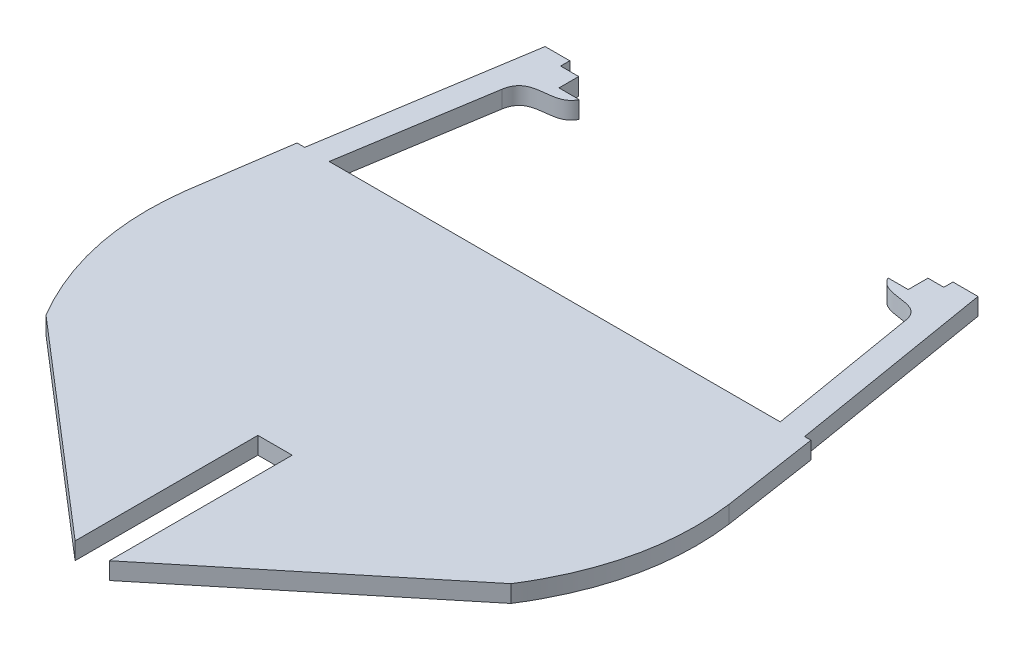
ISO-10303-21;
HEADER;
FILE_DESCRIPTION(('STEP AP214'),'2;1');
FILE_NAME('part.step','',(''),(''),'','','');
FILE_SCHEMA(('AUTOMOTIVE_DESIGN { 1 0 10303 214 1 1 1 1 }'));
ENDSEC;
DATA;
#1=APPLICATION_CONTEXT('core data for automotive mechanical design processes');
#2=APPLICATION_PROTOCOL_DEFINITION('international standard','automotive_design',2000,#1);
#3=PRODUCT_CONTEXT('',#1,'mechanical');
#4=PRODUCT('Part','Part','',(#3));
#5=PRODUCT_RELATED_PRODUCT_CATEGORY('part','',(#4));
#6=PRODUCT_DEFINITION_FORMATION('','',#4);
#7=PRODUCT_DEFINITION_CONTEXT('part definition',#1,'design');
#8=PRODUCT_DEFINITION('design','',#6,#7);
#9=PRODUCT_DEFINITION_SHAPE('','',#8);
#10=(LENGTH_UNIT() NAMED_UNIT(*) SI_UNIT(.MILLI.,.METRE.));
#11=(NAMED_UNIT(*) PLANE_ANGLE_UNIT() SI_UNIT($,.RADIAN.));
#12=(NAMED_UNIT(*) SI_UNIT($,.STERADIAN.) SOLID_ANGLE_UNIT());
#13=UNCERTAINTY_MEASURE_WITH_UNIT(LENGTH_MEASURE(1.E-05),#10,'distance_accuracy_value','');
#14=(GEOMETRIC_REPRESENTATION_CONTEXT(3) GLOBAL_UNCERTAINTY_ASSIGNED_CONTEXT((#13)) GLOBAL_UNIT_ASSIGNED_CONTEXT((#10,
#11,#12)) REPRESENTATION_CONTEXT('',''));
#15=CARTESIAN_POINT('',(0.,0.,0.));
#16=DIRECTION('',(0.,0.,1.));
#17=DIRECTION('',(1.,0.,0.));
#18=AXIS2_PLACEMENT_3D('',#15,#16,#17);
#19=CARTESIAN_POINT('',(-7.33547800549502,4.,-1.07714586189832));
#20=DIRECTION('',(0.989390194390958,0.,0.145282632282813));
#21=DIRECTION('',(0.145282632282813,0.,-0.989390194390958));
#22=AXIS2_PLACEMENT_3D('',#19,#20,#21);
#23=PLANE('',#22);
#24=DIRECTION('',(-0.145282632282813,0.,0.989390194390958));
#25=VECTOR('',#24,1.);
#26=CARTESIAN_POINT('',(-7.33547800549502,0.,-1.07714586189832));
#27=LINE('',#26,#25);
#28=CARTESIAN_POINT('',(-7.4936467310962,0.,0.));
#29=VERTEX_POINT('',#28);
#30=CARTESIAN_POINT('',(-10.8148658668984,0.,22.6178559319447));
#31=VERTEX_POINT('',#30);
#32=EDGE_CURVE('E258',#29,#31,#27,.T.);
#33=ORIENTED_EDGE('',*,*,#32,.T.);
#34=DIRECTION('',(0.,-1.,0.));
#35=VECTOR('',#34,1.);
#36=CARTESIAN_POINT('',(-10.8148658668984,4.,22.6178559319447));
#37=LINE('',#36,#35);
#38=CARTESIAN_POINT('',(-10.8148658668984,4.,22.6178559319447));
#39=VERTEX_POINT('',#38);
#40=EDGE_CURVE('E11',#39,#31,#37,.T.);
#41=ORIENTED_EDGE('',*,*,#40,.F.);
#42=DIRECTION('',(-0.145282632282813,0.,0.989390194390958));
#43=VECTOR('',#42,1.);
#44=CARTESIAN_POINT('',(-7.33547800549502,4.,-1.07714586189832));
#45=LINE('',#44,#43);
#46=CARTESIAN_POINT('',(-7.4936467310962,4.,0.));
#47=VERTEX_POINT('',#46);
#48=EDGE_CURVE('E348',#47,#39,#45,.T.);
#49=ORIENTED_EDGE('',*,*,#48,.F.);
#50=DIRECTION('',(0.,-1.,0.));
#51=VECTOR('',#50,1.);
#52=CARTESIAN_POINT('',(-7.4936467310962,4.,0.));
#53=LINE('',#52,#51);
#54=EDGE_CURVE('E254',#47,#29,#53,.T.);
#55=ORIENTED_EDGE('',*,*,#54,.T.);
#56=EDGE_LOOP('',(#33,#41,#49,#55));
#57=FACE_BOUND('',#56,.T.);
#58=ADVANCED_FACE('F43',(#57),#23,.F.);
#59=CARTESIAN_POINT('',(-10.8148658668984,4.,22.6178559319447));
#60=CARTESIAN_POINT('',(-13.5831427047699,4.,44.4263441016462));
#61=CARTESIAN_POINT('',(-1.98899974035488,4.,64.010756010048));
#62=B_SPLINE_CURVE_WITH_KNOTS('',2,(#59,#60,#61),.UNSPECIFIED.,.F.,.F.,(3,3),(0.,1.),.UNSPECIFIED.);
#63=DIRECTION('',(0.,-1.,0.));
#64=VECTOR('',#63,1.);
#65=SURFACE_OF_LINEAR_EXTRUSION('',#62,#64);
#66=CARTESIAN_POINT('',(-10.8148658668984,0.,22.6178559319447));
#67=CARTESIAN_POINT('',(-13.5831427047699,0.,44.4263441016462));
#68=CARTESIAN_POINT('',(-1.98899974035488,0.,64.010756010048));
#69=B_SPLINE_CURVE_WITH_KNOTS('',2,(#66,#67,#68),.UNSPECIFIED.,.F.,.F.,(3,3),(0.,1.),.UNSPECIFIED.);
#70=CARTESIAN_POINT('',(-1.98899974035488,0.,64.010756010048));
#71=VERTEX_POINT('',#70);
#72=EDGE_CURVE('E261',#31,#71,#69,.T.);
#73=ORIENTED_EDGE('',*,*,#72,.T.);
#74=DIRECTION('',(0.,-1.,0.));
#75=VECTOR('',#74,1.);
#76=CARTESIAN_POINT('',(-1.98899974035488,4.,64.010756010048));
#77=LINE('',#76,#75);
#78=CARTESIAN_POINT('',(-1.98899974035488,4.,64.010756010048));
#79=VERTEX_POINT('',#78);
#80=EDGE_CURVE('E51',#79,#71,#77,.T.);
#81=ORIENTED_EDGE('',*,*,#80,.F.);
#82=EDGE_CURVE('E158',#39,#79,#62,.T.);
#83=ORIENTED_EDGE('',*,*,#82,.F.);
#84=ORIENTED_EDGE('',*,*,#40,.T.);
#85=EDGE_LOOP('',(#73,#81,#83,#84));
#86=FACE_BOUND('',#85,.T.);
#87=ADVANCED_FACE('F410',(#86),#65,.F.);
#88=CARTESIAN_POINT('',(-32.5002188720918,4.,37.7257732194009));
#89=DIRECTION('',(-0.652686136054112,0.,0.757628410107985));
#90=DIRECTION('',(0.757628410107985,0.,0.652686136054112));
#91=AXIS2_PLACEMENT_3D('',#88,#89,#90);
#92=PLANE('',#91);
#93=DIRECTION('',(-0.757628410107985,0.,-0.652686136054112));
#94=VECTOR('',#93,1.);
#95=CARTESIAN_POINT('',(-32.5002188720918,0.,37.7257732194009));
#96=LINE('',#95,#94);
#97=CARTESIAN_POINT('',(46.9680835929784,0.,106.186589343381));
#98=VERTEX_POINT('',#97);
#99=EDGE_CURVE('E266',#98,#71,#96,.T.);
#100=ORIENTED_EDGE('',*,*,#99,.F.);
#101=DIRECTION('',(0.,-1.,0.));
#102=VECTOR('',#101,1.);
#103=CARTESIAN_POINT('',(46.9680835929784,4.,106.186589343381));
#104=LINE('',#103,#102);
#105=CARTESIAN_POINT('',(46.9680835929784,4.,106.186589343381));
#106=VERTEX_POINT('',#105);
#107=EDGE_CURVE('E403',#106,#98,#104,.T.);
#108=ORIENTED_EDGE('',*,*,#107,.F.);
#109=DIRECTION('',(-0.757628410107985,0.,-0.652686136054112));
#110=VECTOR('',#109,1.);
#111=CARTESIAN_POINT('',(-32.5002188720918,4.,37.7257732194009));
#112=LINE('',#111,#110);
#113=EDGE_CURVE('E409',#106,#79,#112,.T.);
#114=ORIENTED_EDGE('',*,*,#113,.T.);
#115=ORIENTED_EDGE('',*,*,#80,.T.);
#116=EDGE_LOOP('',(#100,#108,#114,#115));
#117=FACE_BOUND('',#116,.T.);
#118=ADVANCED_FACE('F407',(#117),#92,.T.);
#119=CARTESIAN_POINT('',(46.9680835929784,4.,0.));
#120=DIRECTION('',(1.,0.,0.));
#121=DIRECTION('',(0.,0.,-1.));
#122=AXIS2_PLACEMENT_3D('',#119,#120,#121);
#123=PLANE('',#122);
#124=DIRECTION('',(0.,0.,1.));
#125=VECTOR('',#124,1.);
#126=CARTESIAN_POINT('',(46.9680835929784,0.,0.));
#127=LINE('',#126,#125);
#128=CARTESIAN_POINT('',(46.9680835929784,0.,63.586589343381));
#129=VERTEX_POINT('',#128);
#130=EDGE_CURVE('E272',#129,#98,#127,.T.);
#131=ORIENTED_EDGE('',*,*,#130,.F.);
#132=DIRECTION('',(0.,-1.,0.));
#133=VECTOR('',#132,1.);
#134=CARTESIAN_POINT('',(46.9680835929784,4.,63.586589343381));
#135=LINE('',#134,#133);
#136=CARTESIAN_POINT('',(46.9680835929784,4.,63.586589343381));
#137=VERTEX_POINT('',#136);
#138=EDGE_CURVE('E401',#137,#129,#135,.T.);
#139=ORIENTED_EDGE('',*,*,#138,.F.);
#140=DIRECTION('',(0.,0.,1.));
#141=VECTOR('',#140,1.);
#142=CARTESIAN_POINT('',(46.9680835929784,4.,0.));
#143=LINE('',#142,#141);
#144=EDGE_CURVE('E421',#137,#106,#143,.T.);
#145=ORIENTED_EDGE('',*,*,#144,.T.);
#146=ORIENTED_EDGE('',*,*,#107,.T.);
#147=EDGE_LOOP('',(#131,#139,#145,#146));
#148=FACE_BOUND('',#147,.T.);
#149=ADVANCED_FACE('F418',(#148),#123,.T.);
#150=CARTESIAN_POINT('',(0.,4.,63.586589343381));
#151=DIRECTION('',(0.,0.,1.));
#152=DIRECTION('',(1.,0.,0.));
#153=AXIS2_PLACEMENT_3D('',#150,#151,#152);
#154=PLANE('',#153);
#155=DIRECTION('',(-1.,0.,0.));
#156=VECTOR('',#155,1.);
#157=CARTESIAN_POINT('',(0.,0.,63.586589343381));
#158=LINE('',#157,#156);
#159=CARTESIAN_POINT('',(54.9680835929783,0.,63.586589343381));
#160=VERTEX_POINT('',#159);
#161=EDGE_CURVE('E275',#160,#129,#158,.T.);
#162=ORIENTED_EDGE('',*,*,#161,.F.);
#163=DIRECTION('',(0.,-1.,0.));
#164=VECTOR('',#163,1.);
#165=CARTESIAN_POINT('',(54.9680835929783,4.,63.586589343381));
#166=LINE('',#165,#164);
#167=CARTESIAN_POINT('',(54.9680835929783,4.,63.586589343381));
#168=VERTEX_POINT('',#167);
#169=EDGE_CURVE('E399',#168,#160,#166,.T.);
#170=ORIENTED_EDGE('',*,*,#169,.F.);
#171=DIRECTION('',(-1.,0.,0.));
#172=VECTOR('',#171,1.);
#173=CARTESIAN_POINT('',(0.,4.,63.586589343381));
#174=LINE('',#173,#172);
#175=EDGE_CURVE('E425',#168,#137,#174,.T.);
#176=ORIENTED_EDGE('',*,*,#175,.T.);
#177=ORIENTED_EDGE('',*,*,#138,.T.);
#178=EDGE_LOOP('',(#162,#170,#176,#177));
#179=FACE_BOUND('',#178,.T.);
#180=ADVANCED_FACE('F466',(#179),#154,.T.);
#181=CARTESIAN_POINT('',(54.9680835929779,4.,-2.8651094847157E-13));
#182=DIRECTION('',(-1.,0.,0.));
#183=DIRECTION('',(0.,0.,1.));
#184=AXIS2_PLACEMENT_3D('',#181,#182,#183);
#185=PLANE('',#184);
#186=DIRECTION('',(0.,0.,-1.));
#187=VECTOR('',#186,1.);
#188=CARTESIAN_POINT('',(54.9680835929779,0.,-2.8651094847157E-13));
#189=LINE('',#188,#187);
#190=CARTESIAN_POINT('',(54.9680835929785,0.,106.186589343381));
#191=VERTEX_POINT('',#190);
#192=EDGE_CURVE('E278',#191,#160,#189,.T.);
#193=ORIENTED_EDGE('',*,*,#192,.F.);
#194=DIRECTION('',(0.,-1.,0.));
#195=VECTOR('',#194,1.);
#196=CARTESIAN_POINT('',(54.9680835929785,4.,106.186589343381));
#197=LINE('',#196,#195);
#198=CARTESIAN_POINT('',(54.9680835929785,4.,106.186589343381));
#199=VERTEX_POINT('',#198);
#200=EDGE_CURVE('E397',#199,#191,#197,.T.);
#201=ORIENTED_EDGE('',*,*,#200,.F.);
#202=DIRECTION('',(0.,0.,-1.));
#203=VECTOR('',#202,1.);
#204=CARTESIAN_POINT('',(54.9680835929779,4.,-2.8651094847157E-13));
#205=LINE('',#204,#203);
#206=EDGE_CURVE('E434',#199,#168,#205,.T.);
#207=ORIENTED_EDGE('',*,*,#206,.T.);
#208=ORIENTED_EDGE('',*,*,#169,.T.);
#209=EDGE_LOOP('',(#193,#201,#207,#208));
#210=FACE_BOUND('',#209,.T.);
#211=ADVANCED_FACE('F462',(#210),#185,.T.);
#212=CARTESIAN_POINT('',(74.1588937462754,4.,90.4527471306288));
#213=DIRECTION('',(0.63401640648034,0.,0.773319595195775));
#214=DIRECTION('',(0.773319595195775,0.,-0.63401640648034));
#215=AXIS2_PLACEMENT_3D('',#212,#213,#214);
#216=PLANE('',#215);
#217=DIRECTION('',(-0.773319595195775,0.,0.63401640648034));
#218=VECTOR('',#217,1.);
#219=CARTESIAN_POINT('',(74.1588937462754,0.,90.4527471306288));
#220=LINE('',#219,#218);
#221=CARTESIAN_POINT('',(106.410598371796,0.,64.010756010048));
#222=VERTEX_POINT('',#221);
#223=EDGE_CURVE('E281',#222,#191,#220,.T.);
#224=ORIENTED_EDGE('',*,*,#223,.F.);
#225=DIRECTION('',(0.,-1.,0.));
#226=VECTOR('',#225,1.);
#227=CARTESIAN_POINT('',(106.410598371796,4.,64.010756010048));
#228=LINE('',#227,#226);
#229=CARTESIAN_POINT('',(106.410598371796,4.,64.010756010048));
#230=VERTEX_POINT('',#229);
#231=EDGE_CURVE('E395',#230,#222,#228,.T.);
#232=ORIENTED_EDGE('',*,*,#231,.F.);
#233=DIRECTION('',(-0.773319595195775,0.,0.63401640648034));
#234=VECTOR('',#233,1.);
#235=CARTESIAN_POINT('',(74.1588937462754,4.,90.4527471306288));
#236=LINE('',#235,#234);
#237=EDGE_CURVE('E437',#230,#199,#236,.T.);
#238=ORIENTED_EDGE('',*,*,#237,.T.);
#239=ORIENTED_EDGE('',*,*,#200,.T.);
#240=EDGE_LOOP('',(#224,#232,#238,#239));
#241=FACE_BOUND('',#240,.T.);
#242=ADVANCED_FACE('F457',(#241),#216,.T.);
#243=CARTESIAN_POINT('',(115.792042318258,4.,22.6178559319438));
#244=CARTESIAN_POINT('',(118.672533555639,4.,44.533714829285));
#245=CARTESIAN_POINT('',(106.410598371796,4.,64.010756010048));
#246=B_SPLINE_CURVE_WITH_KNOTS('',2,(#243,#244,#245),.UNSPECIFIED.,.F.,.F.,(3,3),(0.,1.),.UNSPECIFIED.);
#247=DIRECTION('',(0.,-1.,0.));
#248=VECTOR('',#247,1.);
#249=SURFACE_OF_LINEAR_EXTRUSION('',#246,#248);
#250=CARTESIAN_POINT('',(115.792042318258,0.,22.6178559319438));
#251=CARTESIAN_POINT('',(118.672533555639,0.,44.533714829285));
#252=CARTESIAN_POINT('',(106.410598371796,0.,64.010756010048));
#253=B_SPLINE_CURVE_WITH_KNOTS('',2,(#250,#251,#252),.UNSPECIFIED.,.F.,.F.,(3,3),(0.,1.),.UNSPECIFIED.);
#254=CARTESIAN_POINT('',(115.792042318258,0.,22.6178559319438));
#255=VERTEX_POINT('',#254);
#256=EDGE_CURVE('E284',#255,#222,#253,.T.);
#257=ORIENTED_EDGE('',*,*,#256,.F.);
#258=DIRECTION('',(0.,-1.,0.));
#259=VECTOR('',#258,1.);
#260=CARTESIAN_POINT('',(115.792042318258,4.,22.6178559319438));
#261=LINE('',#260,#259);
#262=CARTESIAN_POINT('',(115.792042318258,4.,22.6178559319438));
#263=VERTEX_POINT('',#262);
#264=EDGE_CURVE('E393',#263,#255,#261,.T.);
#265=ORIENTED_EDGE('',*,*,#264,.F.);
#266=EDGE_CURVE('E440',#263,#230,#246,.T.);
#267=ORIENTED_EDGE('',*,*,#266,.T.);
#268=ORIENTED_EDGE('',*,*,#231,.T.);
#269=EDGE_LOOP('',(#257,#265,#267,#268));
#270=FACE_BOUND('',#269,.T.);
#271=ADVANCED_FACE('F452',(#270),#249,.T.);
#272=CARTESIAN_POINT('',(109.874652264824,4.,-16.5848531720497));
#273=DIRECTION('',(-0.988799086686587,0.,0.149252692330057));
#274=DIRECTION('',(0.149252692330057,0.,0.988799086686587));
#275=AXIS2_PLACEMENT_3D('',#272,#273,#274);
#276=PLANE('',#275);
#277=DIRECTION('',(-0.149252692330057,0.,-0.988799086686587));
#278=VECTOR('',#277,1.);
#279=CARTESIAN_POINT('',(109.874652264824,0.,-16.5848531720497));
#280=LINE('',#279,#278);
#281=CARTESIAN_POINT('',(112.39635687521,0.,0.121439871751949));
#282=VERTEX_POINT('',#281);
#283=EDGE_CURVE('E289',#255,#282,#280,.T.);
#284=ORIENTED_EDGE('',*,*,#283,.T.);
#285=DIRECTION('',(0.,-1.,0.));
#286=VECTOR('',#285,1.);
#287=CARTESIAN_POINT('',(112.39635687521,4.,0.121439871751949));
#288=LINE('',#287,#286);
#289=CARTESIAN_POINT('',(112.39635687521,4.,0.121439871751949));
#290=VERTEX_POINT('',#289);
#291=EDGE_CURVE('E390',#290,#282,#288,.T.);
#292=ORIENTED_EDGE('',*,*,#291,.F.);
#293=DIRECTION('',(-0.149252692330057,0.,-0.988799086686587));
#294=VECTOR('',#293,1.);
#295=CARTESIAN_POINT('',(109.874652264824,4.,-16.5848531720497));
#296=LINE('',#295,#294);
#297=EDGE_CURVE('E446',#263,#290,#296,.T.);
#298=ORIENTED_EDGE('',*,*,#297,.F.);
#299=ORIENTED_EDGE('',*,*,#264,.T.);
#300=EDGE_LOOP('',(#284,#292,#298,#299));
#301=FACE_BOUND('',#300,.T.);
#302=ADVANCED_FACE('F456',(#301),#276,.F.);
#303=CARTESIAN_POINT('',(0.,4.,0.121439871751949));
#304=DIRECTION('',(0.,0.,1.));
#305=DIRECTION('',(1.,0.,0.));
#306=AXIS2_PLACEMENT_3D('',#303,#304,#305);
#307=PLANE('',#306);
#308=DIRECTION('',(-1.,0.,0.));
#309=VECTOR('',#308,1.);
#310=CARTESIAN_POINT('',(0.,0.,0.121439871751949));
#311=LINE('',#310,#309);
#312=CARTESIAN_POINT('',(110.919371617657,0.,0.121439871751949));
#313=VERTEX_POINT('',#312);
#314=EDGE_CURVE('E294',#282,#313,#311,.T.);
#315=ORIENTED_EDGE('',*,*,#314,.T.);
#316=DIRECTION('',(0.,-1.,0.));
#317=VECTOR('',#316,1.);
#318=CARTESIAN_POINT('',(110.919371617657,4.,0.121439871751949));
#319=LINE('',#318,#317);
#320=CARTESIAN_POINT('',(110.919371617657,4.,0.121439871751949));
#321=VERTEX_POINT('',#320);
#322=EDGE_CURVE('E387',#321,#313,#319,.T.);
#323=ORIENTED_EDGE('',*,*,#322,.F.);
#324=DIRECTION('',(-1.,0.,0.));
#325=VECTOR('',#324,1.);
#326=CARTESIAN_POINT('',(0.,4.,0.121439871751949));
#327=LINE('',#326,#325);
#328=EDGE_CURVE('E571',#290,#321,#327,.T.);
#329=ORIENTED_EDGE('',*,*,#328,.F.);
#330=ORIENTED_EDGE('',*,*,#291,.T.);
#331=EDGE_LOOP('',(#315,#323,#329,#330));
#332=FACE_BOUND('',#331,.T.);
#333=ADVANCED_FACE('F568',(#332),#307,.F.);
#334=CARTESIAN_POINT('',(107.908351377309,4.,-17.9647597251569));
#335=DIRECTION('',(-0.986423504198528,0.,0.164221406536104));
#336=DIRECTION('',(0.164221406536104,0.,0.986423504198528));
#337=AXIS2_PLACEMENT_3D('',#334,#335,#336);
#338=PLANE('',#337);
#339=DIRECTION('',(-0.164221406536104,0.,-0.986423504198528));
#340=VECTOR('',#339,1.);
#341=CARTESIAN_POINT('',(107.908351377309,0.,-17.9647597251569));
#342=LINE('',#341,#340);
#343=CARTESIAN_POINT('',(102.84723169054,0.,-48.3652265211402));
#344=VERTEX_POINT('',#343);
#345=EDGE_CURVE('E296',#313,#344,#342,.T.);
#346=ORIENTED_EDGE('',*,*,#345,.T.);
#347=DIRECTION('',(0.,-1.,0.));
#348=VECTOR('',#347,1.);
#349=CARTESIAN_POINT('',(102.84723169054,4.,-48.3652265211402));
#350=LINE('',#349,#348);
#351=CARTESIAN_POINT('',(102.84723169054,4.,-48.3652265211402));
#352=VERTEX_POINT('',#351);
#353=EDGE_CURVE('E384',#352,#344,#350,.T.);
#354=ORIENTED_EDGE('',*,*,#353,.F.);
#355=DIRECTION('',(-0.164221406536104,0.,-0.986423504198528));
#356=VECTOR('',#355,1.);
#357=CARTESIAN_POINT('',(107.908351377309,4.,-17.9647597251569));
#358=LINE('',#357,#356);
#359=EDGE_CURVE('E562',#321,#352,#358,.T.);
#360=ORIENTED_EDGE('',*,*,#359,.F.);
#361=ORIENTED_EDGE('',*,*,#322,.T.);
#362=EDGE_LOOP('',(#346,#354,#360,#361));
#363=FACE_BOUND('',#362,.T.);
#364=ADVANCED_FACE('F561',(#363),#338,.F.);
#365=CARTESIAN_POINT('',(0.,4.,-48.3652265211402));
#366=DIRECTION('',(0.,0.,1.));
#367=DIRECTION('',(1.,0.,0.));
#368=AXIS2_PLACEMENT_3D('',#365,#366,#367);
#369=PLANE('',#368);
#370=DIRECTION('',(-1.,0.,0.));
#371=VECTOR('',#370,1.);
#372=CARTESIAN_POINT('',(0.,0.,-48.3652265211402));
#373=LINE('',#372,#371);
#374=CARTESIAN_POINT('',(97.014954374756,0.,-48.3652265211402));
#375=VERTEX_POINT('',#374);
#376=EDGE_CURVE('E298',#344,#375,#373,.T.);
#377=ORIENTED_EDGE('',*,*,#376,.T.);
#378=DIRECTION('',(0.,-1.,0.));
#379=VECTOR('',#378,1.);
#380=CARTESIAN_POINT('',(97.014954374756,4.,-48.3652265211402));
#381=LINE('',#380,#379);
#382=CARTESIAN_POINT('',(97.014954374756,4.,-48.3652265211402));
#383=VERTEX_POINT('',#382);
#384=EDGE_CURVE('E381',#383,#375,#381,.T.);
#385=ORIENTED_EDGE('',*,*,#384,.F.);
#386=DIRECTION('',(-1.,0.,0.));
#387=VECTOR('',#386,1.);
#388=CARTESIAN_POINT('',(0.,4.,-48.3652265211402));
#389=LINE('',#388,#387);
#390=EDGE_CURVE('E557',#352,#383,#389,.T.);
#391=ORIENTED_EDGE('',*,*,#390,.F.);
#392=ORIENTED_EDGE('',*,*,#353,.T.);
#393=EDGE_LOOP('',(#377,#385,#391,#392));
#394=FACE_BOUND('',#393,.T.);
#395=ADVANCED_FACE('F556',(#394),#369,.F.);
#396=CARTESIAN_POINT('',(97.0149543747535,4.,5.04781401862892E-12));
#397=DIRECTION('',(1.,0.,0.));
#398=DIRECTION('',(0.,0.,-1.));
#399=AXIS2_PLACEMENT_3D('',#396,#397,#398);
#400=PLANE('',#399);
#401=DIRECTION('',(0.,0.,1.));
#402=VECTOR('',#401,1.);
#403=CARTESIAN_POINT('',(97.0149543747535,0.,5.04781401862892E-12));
#404=LINE('',#403,#402);
#405=CARTESIAN_POINT('',(97.0149543747559,0.,-46.2314665275605));
#406=VERTEX_POINT('',#405);
#407=EDGE_CURVE('E300',#375,#406,#404,.T.);
#408=ORIENTED_EDGE('',*,*,#407,.T.);
#409=DIRECTION('',(0.,-1.,0.));
#410=VECTOR('',#409,1.);
#411=CARTESIAN_POINT('',(97.0149543747559,4.,-46.2314665275605));
#412=LINE('',#411,#410);
#413=CARTESIAN_POINT('',(97.0149543747559,4.,-46.2314665275605));
#414=VERTEX_POINT('',#413);
#415=EDGE_CURVE('E378',#414,#406,#412,.T.);
#416=ORIENTED_EDGE('',*,*,#415,.F.);
#417=DIRECTION('',(0.,0.,1.));
#418=VECTOR('',#417,1.);
#419=CARTESIAN_POINT('',(97.0149543747535,4.,5.04781401862892E-12));
#420=LINE('',#419,#418);
#421=EDGE_CURVE('E553',#383,#414,#420,.T.);
#422=ORIENTED_EDGE('',*,*,#421,.F.);
#423=ORIENTED_EDGE('',*,*,#384,.T.);
#424=EDGE_LOOP('',(#408,#416,#422,#423));
#425=FACE_BOUND('',#424,.T.);
#426=ADVANCED_FACE('F550',(#425),#400,.F.);
#427=CARTESIAN_POINT('',(0.,4.,-46.2314665275605));
#428=DIRECTION('',(0.,0.,1.));
#429=DIRECTION('',(1.,0.,0.));
#430=AXIS2_PLACEMENT_3D('',#427,#428,#429);
#431=PLANE('',#430);
#432=DIRECTION('',(-1.,0.,0.));
#433=VECTOR('',#432,1.);
#434=CARTESIAN_POINT('',(0.,0.,-46.2314665275605));
#435=LINE('',#434,#433);
#436=CARTESIAN_POINT('',(93.316437052551,0.,-46.2314665275605));
#437=VERTEX_POINT('',#436);
#438=EDGE_CURVE('E302',#406,#437,#435,.T.);
#439=ORIENTED_EDGE('',*,*,#438,.T.);
#440=DIRECTION('',(0.,-1.,0.));
#441=VECTOR('',#440,1.);
#442=CARTESIAN_POINT('',(93.316437052551,4.,-46.2314665275605));
#443=LINE('',#442,#441);
#444=CARTESIAN_POINT('',(93.316437052551,4.,-46.2314665275605));
#445=VERTEX_POINT('',#444);
#446=EDGE_CURVE('E375',#445,#437,#443,.T.);
#447=ORIENTED_EDGE('',*,*,#446,.F.);
#448=DIRECTION('',(-1.,0.,0.));
#449=VECTOR('',#448,1.);
#450=CARTESIAN_POINT('',(0.,4.,-46.2314665275605));
#451=LINE('',#450,#449);
#452=EDGE_CURVE('E544',#414,#445,#451,.T.);
#453=ORIENTED_EDGE('',*,*,#452,.F.);
#454=ORIENTED_EDGE('',*,*,#415,.T.);
#455=EDGE_LOOP('',(#439,#447,#453,#454));
#456=FACE_BOUND('',#455,.T.);
#457=ADVANCED_FACE('F543',(#456),#431,.F.);
#458=CARTESIAN_POINT('',(93.3164370525527,4.,-3.37405593590003E-12));
#459=DIRECTION('',(1.,0.,0.));
#460=DIRECTION('',(0.,0.,-1.));
#461=AXIS2_PLACEMENT_3D('',#458,#459,#460);
#462=PLANE('',#461);
#463=DIRECTION('',(0.,0.,1.));
#464=VECTOR('',#463,1.);
#465=CARTESIAN_POINT('',(93.3164370525527,0.,-3.37405593590003E-12));
#466=LINE('',#465,#464);
#467=CARTESIAN_POINT('',(93.3164370525512,0.,-41.6256423076921));
#468=VERTEX_POINT('',#467);
#469=EDGE_CURVE('E304',#437,#468,#466,.T.);
#470=ORIENTED_EDGE('',*,*,#469,.T.);
#471=DIRECTION('',(0.,-1.,0.));
#472=VECTOR('',#471,1.);
#473=CARTESIAN_POINT('',(93.3164370525512,4.,-41.6256423076921));
#474=LINE('',#473,#472);
#475=CARTESIAN_POINT('',(93.3164370525512,4.,-41.6256423076921));
#476=VERTEX_POINT('',#475);
#477=EDGE_CURVE('E372',#476,#468,#474,.T.);
#478=ORIENTED_EDGE('',*,*,#477,.F.);
#479=DIRECTION('',(0.,0.,1.));
#480=VECTOR('',#479,1.);
#481=CARTESIAN_POINT('',(93.3164370525527,4.,-3.37405593590003E-12));
#482=LINE('',#481,#480);
#483=EDGE_CURVE('E539',#445,#476,#482,.T.);
#484=ORIENTED_EDGE('',*,*,#483,.F.);
#485=ORIENTED_EDGE('',*,*,#446,.T.);
#486=EDGE_LOOP('',(#470,#478,#484,#485));
#487=FACE_BOUND('',#486,.T.);
#488=ADVANCED_FACE('F538',(#487),#462,.F.);
#489=CARTESIAN_POINT('',(-9.84471003040779E-13,4.,-41.6256423076899));
#490=DIRECTION('',(0.,0.,1.));
#491=DIRECTION('',(1.,0.,0.));
#492=AXIS2_PLACEMENT_3D('',#489,#490,#491);
#493=PLANE('',#492);
#494=DIRECTION('',(-1.,0.,0.));
#495=VECTOR('',#494,1.);
#496=CARTESIAN_POINT('',(-9.84471003040779E-13,0.,-41.6256423076899));
#497=LINE('',#496,#495);
#498=CARTESIAN_POINT('',(88.6221650666759,0.,-41.6256423076919));
#499=VERTEX_POINT('',#498);
#500=EDGE_CURVE('E306',#468,#499,#497,.T.);
#501=ORIENTED_EDGE('',*,*,#500,.T.);
#502=DIRECTION('',(0.,-1.,0.));
#503=VECTOR('',#502,1.);
#504=CARTESIAN_POINT('',(88.6221650666759,4.,-41.6256423076919));
#505=LINE('',#504,#503);
#506=CARTESIAN_POINT('',(88.6221650666759,4.,-41.6256423076919));
#507=VERTEX_POINT('',#506);
#508=EDGE_CURVE('E369',#507,#499,#505,.T.);
#509=ORIENTED_EDGE('',*,*,#508,.F.);
#510=DIRECTION('',(-1.,0.,0.));
#511=VECTOR('',#510,1.);
#512=CARTESIAN_POINT('',(-9.84471003040779E-13,4.,-41.6256423076899));
#513=LINE('',#512,#511);
#514=EDGE_CURVE('E535',#476,#507,#513,.T.);
#515=ORIENTED_EDGE('',*,*,#514,.F.);
#516=ORIENTED_EDGE('',*,*,#477,.T.);
#517=EDGE_LOOP('',(#501,#509,#515,#516));
#518=FACE_BOUND('',#517,.T.);
#519=ADVANCED_FACE('F532',(#518),#493,.F.);
#520=CARTESIAN_POINT('',(88.6221650666759,4.,-41.6256423076919));
#521=CARTESIAN_POINT('',(91.0292565429631,4.,-36.9042540586062));
#522=CARTESIAN_POINT('',(98.5718569560328,4.,-41.1780853700964));
#523=CARTESIAN_POINT('',(99.2909650345743,4.,-34.7091625622303));
#524=B_SPLINE_CURVE_WITH_KNOTS('',3,(#520,#521,#522,#523),.UNSPECIFIED.,.F.,.F.,(4,4),(0.,1.),.UNSPECIFIED.);
#525=DIRECTION('',(0.,-1.,0.));
#526=VECTOR('',#525,1.);
#527=SURFACE_OF_LINEAR_EXTRUSION('',#524,#526);
#528=CARTESIAN_POINT('',(88.6221650666759,0.,-41.6256423076919));
#529=CARTESIAN_POINT('',(91.0292565429631,0.,-36.9042540586062));
#530=CARTESIAN_POINT('',(98.5718569560328,0.,-41.1780853700964));
#531=CARTESIAN_POINT('',(99.2909650345743,0.,-34.7091625622303));
#532=B_SPLINE_CURVE_WITH_KNOTS('',3,(#528,#529,#530,#531),.UNSPECIFIED.,.F.,.F.,(4,4),(0.,1.),.UNSPECIFIED.);
#533=CARTESIAN_POINT('',(99.2909650345743,0.,-34.7091625622303));
#534=VERTEX_POINT('',#533);
#535=EDGE_CURVE('E308',#499,#534,#532,.T.);
#536=ORIENTED_EDGE('',*,*,#535,.T.);
#537=DIRECTION('',(0.,-1.,0.));
#538=VECTOR('',#537,1.);
#539=CARTESIAN_POINT('',(99.2909650345743,4.,-34.7091625622303));
#540=LINE('',#539,#538);
#541=CARTESIAN_POINT('',(99.2909650345743,4.,-34.7091625622303));
#542=VERTEX_POINT('',#541);
#543=EDGE_CURVE('E367',#542,#534,#540,.T.);
#544=ORIENTED_EDGE('',*,*,#543,.F.);
#545=EDGE_CURVE('E586',#507,#542,#524,.T.);
#546=ORIENTED_EDGE('',*,*,#545,.F.);
#547=ORIENTED_EDGE('',*,*,#508,.T.);
#548=EDGE_LOOP('',(#536,#544,#546,#547));
#549=FACE_BOUND('',#548,.T.);
#550=ADVANCED_FACE('F526',(#549),#527,.F.);
#551=CARTESIAN_POINT('',(102.236590433556,4.,-17.1790992121962));
#552=DIRECTION('',(-0.986174582632782,0.,0.165709663475185));
#553=DIRECTION('',(0.165709663475185,0.,0.986174582632782));
#554=AXIS2_PLACEMENT_3D('',#551,#552,#553);
#555=PLANE('',#554);
#556=DIRECTION('',(-0.165709663475185,0.,-0.986174582632782));
#557=VECTOR('',#556,1.);
#558=CARTESIAN_POINT('',(102.236590433556,0.,-17.1790992121962));
#559=LINE('',#558,#557);
#560=CARTESIAN_POINT('',(105.123242350359,0.,-7.21644966006352E-13));
#561=VERTEX_POINT('',#560);
#562=EDGE_CURVE('E313',#561,#534,#559,.T.);
#563=ORIENTED_EDGE('',*,*,#562,.F.);
#564=DIRECTION('',(0.,-1.,0.));
#565=VECTOR('',#564,1.);
#566=CARTESIAN_POINT('',(105.123242350359,4.,-7.21644966006352E-13));
#567=LINE('',#566,#565);
#568=CARTESIAN_POINT('',(105.123242350359,4.,-7.21644966006352E-13));
#569=VERTEX_POINT('',#568);
#570=EDGE_CURVE('E365',#569,#561,#567,.T.);
#571=ORIENTED_EDGE('',*,*,#570,.F.);
#572=DIRECTION('',(-0.165709663475185,0.,-0.986174582632782));
#573=VECTOR('',#572,1.);
#574=CARTESIAN_POINT('',(102.236590433556,4.,-17.1790992121962));
#575=LINE('',#574,#573);
#576=EDGE_CURVE('E523',#569,#542,#575,.T.);
#577=ORIENTED_EDGE('',*,*,#576,.T.);
#578=ORIENTED_EDGE('',*,*,#543,.T.);
#579=EDGE_LOOP('',(#563,#571,#577,#578));
#580=FACE_BOUND('',#579,.T.);
#581=ADVANCED_FACE('F518',(#580),#555,.T.);
#582=CARTESIAN_POINT('',(0.,4.,0.));
#583=DIRECTION('',(0.,0.,1.));
#584=DIRECTION('',(1.,0.,0.));
#585=AXIS2_PLACEMENT_3D('',#582,#583,#584);
#586=PLANE('',#585);
#587=DIRECTION('',(-1.,0.,0.));
#588=VECTOR('',#587,1.);
#589=CARTESIAN_POINT('',(0.,0.,0.));
#590=LINE('',#589,#588);
#591=CARTESIAN_POINT('',(0.,0.,0.));
#592=VERTEX_POINT('',#591);
#593=EDGE_CURVE('E319',#561,#592,#590,.T.);
#594=ORIENTED_EDGE('',*,*,#593,.T.);
#595=DIRECTION('',(0.,-1.,0.));
#596=VECTOR('',#595,1.);
#597=CARTESIAN_POINT('',(0.,4.,0.));
#598=LINE('',#597,#596);
#599=CARTESIAN_POINT('',(0.,4.,0.));
#600=VERTEX_POINT('',#599);
#601=EDGE_CURVE('E362',#600,#592,#598,.T.);
#602=ORIENTED_EDGE('',*,*,#601,.F.);
#603=DIRECTION('',(-1.,0.,0.));
#604=VECTOR('',#603,1.);
#605=CARTESIAN_POINT('',(0.,4.,0.));
#606=LINE('',#605,#604);
#607=EDGE_CURVE('E831',#569,#600,#606,.T.);
#608=ORIENTED_EDGE('',*,*,#607,.F.);
#609=ORIENTED_EDGE('',*,*,#570,.T.);
#610=EDGE_LOOP('',(#594,#602,#608,#609));
#611=FACE_BOUND('',#610,.T.);
#612=ADVANCED_FACE('F709',(#611),#586,.F.);
#613=CARTESIAN_POINT('',(0.,4.,0.));
#614=DIRECTION('',(-0.987465873537486,0.,-0.157832660114593));
#615=DIRECTION('',(-0.157832660114593,0.,0.987465873537487));
#616=AXIS2_PLACEMENT_3D('',#613,#614,#615);
#617=PLANE('',#616);
#618=DIRECTION('',(0.157832660114593,0.,-0.987465873537486));
#619=VECTOR('',#618,1.);
#620=CARTESIAN_POINT('',(0.,0.,0.));
#621=LINE('',#620,#619);
#622=CARTESIAN_POINT('',(5.54777598330702,0.,-34.7091625622296));
#623=VERTEX_POINT('',#622);
#624=EDGE_CURVE('E321',#592,#623,#621,.T.);
#625=ORIENTED_EDGE('',*,*,#624,.T.);
#626=DIRECTION('',(0.,-1.,0.));
#627=VECTOR('',#626,1.);
#628=CARTESIAN_POINT('',(5.54777598330702,4.,-34.7091625622296));
#629=LINE('',#628,#627);
#630=CARTESIAN_POINT('',(5.54777598330702,4.,-34.7091625622296));
#631=VERTEX_POINT('',#630);
#632=EDGE_CURVE('E360',#631,#623,#629,.T.);
#633=ORIENTED_EDGE('',*,*,#632,.F.);
#634=DIRECTION('',(0.157832660114593,0.,-0.987465873537486));
#635=VECTOR('',#634,1.);
#636=CARTESIAN_POINT('',(0.,4.,0.));
#637=LINE('',#636,#635);
#638=EDGE_CURVE('E824',#600,#631,#637,.T.);
#639=ORIENTED_EDGE('',*,*,#638,.F.);
#640=ORIENTED_EDGE('',*,*,#601,.T.);
#641=EDGE_LOOP('',(#625,#633,#639,#640));
#642=FACE_BOUND('',#641,.T.);
#643=ADVANCED_FACE('F511',(#642),#617,.F.);
#644=CARTESIAN_POINT('',(16.6490616022369,4.,-41.6256423076916));
#645=CARTESIAN_POINT('',(14.2964060236995,4.,-36.8892715632356));
#646=CARTESIAN_POINT('',(6.7076081195537,4.,-41.3984737904622));
#647=CARTESIAN_POINT('',(5.54777598330702,4.,-34.7091625622296));
#648=B_SPLINE_CURVE_WITH_KNOTS('',3,(#644,#645,#646,#647),.UNSPECIFIED.,.F.,.F.,(4,4),(0.,1.),.UNSPECIFIED.);
#649=DIRECTION('',(0.,-1.,0.));
#650=VECTOR('',#649,1.);
#651=SURFACE_OF_LINEAR_EXTRUSION('',#648,#650);
#652=CARTESIAN_POINT('',(16.6490616022369,0.,-41.6256423076916));
#653=CARTESIAN_POINT('',(14.2964060236995,0.,-36.8892715632356));
#654=CARTESIAN_POINT('',(6.7076081195537,0.,-41.3984737904622));
#655=CARTESIAN_POINT('',(5.54777598330702,0.,-34.7091625622296));
#656=B_SPLINE_CURVE_WITH_KNOTS('',3,(#652,#653,#654,#655),.UNSPECIFIED.,.F.,.F.,(4,4),(0.,1.),.UNSPECIFIED.);
#657=CARTESIAN_POINT('',(16.6490616022369,0.,-41.6256423076916));
#658=VERTEX_POINT('',#657);
#659=EDGE_CURVE('E324',#658,#623,#656,.T.);
#660=ORIENTED_EDGE('',*,*,#659,.F.);
#661=DIRECTION('',(0.,-1.,0.));
#662=VECTOR('',#661,1.);
#663=CARTESIAN_POINT('',(16.6490616022369,4.,-41.6256423076916));
#664=LINE('',#663,#662);
#665=CARTESIAN_POINT('',(16.6490616022369,4.,-41.6256423076916));
#666=VERTEX_POINT('',#665);
#667=EDGE_CURVE('E358',#666,#658,#664,.T.);
#668=ORIENTED_EDGE('',*,*,#667,.F.);
#669=EDGE_CURVE('E508',#666,#631,#648,.T.);
#670=ORIENTED_EDGE('',*,*,#669,.T.);
#671=ORIENTED_EDGE('',*,*,#632,.T.);
#672=EDGE_LOOP('',(#660,#668,#670,#671));
#673=FACE_BOUND('',#672,.T.);
#674=ADVANCED_FACE('F506',(#673),#651,.T.);
#675=CARTESIAN_POINT('',(-2.44447319215375E-13,4.,-41.6256423076915));
#676=DIRECTION('',(0.,0.,-1.));
#677=DIRECTION('',(-1.,0.,0.));
#678=AXIS2_PLACEMENT_3D('',#675,#676,#677);
#679=PLANE('',#678);
#680=DIRECTION('',(1.,0.,0.));
#681=VECTOR('',#680,1.);
#682=CARTESIAN_POINT('',(-2.44447319215375E-13,0.,-41.6256423076915));
#683=LINE('',#682,#681);
#684=CARTESIAN_POINT('',(11.9227112935951,0.,-41.6256423076916));
#685=VERTEX_POINT('',#684);
#686=EDGE_CURVE('E329',#685,#658,#683,.T.);
#687=ORIENTED_EDGE('',*,*,#686,.F.);
#688=DIRECTION('',(0.,-1.,0.));
#689=VECTOR('',#688,1.);
#690=CARTESIAN_POINT('',(11.9227112935951,4.,-41.6256423076916));
#691=LINE('',#690,#689);
#692=CARTESIAN_POINT('',(11.9227112935951,4.,-41.6256423076916));
#693=VERTEX_POINT('',#692);
#694=EDGE_CURVE('E356',#693,#685,#691,.T.);
#695=ORIENTED_EDGE('',*,*,#694,.F.);
#696=DIRECTION('',(1.,0.,0.));
#697=VECTOR('',#696,1.);
#698=CARTESIAN_POINT('',(-2.44447319215375E-13,4.,-41.6256423076915));
#699=LINE('',#698,#697);
#700=EDGE_CURVE('E502',#693,#666,#699,.T.);
#701=ORIENTED_EDGE('',*,*,#700,.T.);
#702=ORIENTED_EDGE('',*,*,#667,.T.);
#703=EDGE_LOOP('',(#687,#695,#701,#702));
#704=FACE_BOUND('',#703,.T.);
#705=ADVANCED_FACE('F499',(#704),#679,.T.);
#706=CARTESIAN_POINT('',(11.9227112935971,4.,-5.74788266430567E-13));
#707=DIRECTION('',(1.,0.,0.));
#708=DIRECTION('',(0.,0.,-1.));
#709=AXIS2_PLACEMENT_3D('',#706,#707,#708);
#710=PLANE('',#709);
#711=DIRECTION('',(0.,0.,1.));
#712=VECTOR('',#711,1.);
#713=CARTESIAN_POINT('',(11.9227112935971,0.,-5.74788266430567E-13));
#714=LINE('',#713,#712);
#715=CARTESIAN_POINT('',(11.9227112935948,0.,-46.2314665275598));
#716=VERTEX_POINT('',#715);
#717=EDGE_CURVE('E335',#716,#685,#714,.T.);
#718=ORIENTED_EDGE('',*,*,#717,.F.);
#719=DIRECTION('',(0.,-1.,0.));
#720=VECTOR('',#719,1.);
#721=CARTESIAN_POINT('',(11.9227112935948,4.,-46.2314665275598));
#722=LINE('',#721,#720);
#723=CARTESIAN_POINT('',(11.9227112935948,4.,-46.2314665275598));
#724=VERTEX_POINT('',#723);
#725=EDGE_CURVE('E354',#724,#716,#722,.T.);
#726=ORIENTED_EDGE('',*,*,#725,.F.);
#727=DIRECTION('',(0.,0.,1.));
#728=VECTOR('',#727,1.);
#729=CARTESIAN_POINT('',(11.9227112935971,4.,-5.74788266430567E-13));
#730=LINE('',#729,#728);
#731=EDGE_CURVE('E829',#724,#693,#730,.T.);
#732=ORIENTED_EDGE('',*,*,#731,.T.);
#733=ORIENTED_EDGE('',*,*,#694,.T.);
#734=EDGE_LOOP('',(#718,#726,#732,#733));
#735=FACE_BOUND('',#734,.T.);
#736=ADVANCED_FACE('F494',(#735),#710,.T.);
#737=CARTESIAN_POINT('',(9.13210801831435E-13,4.,-46.23146652756));
#738=DIRECTION('',(0.,0.,-1.));
#739=DIRECTION('',(-1.,0.,0.));
#740=AXIS2_PLACEMENT_3D('',#737,#738,#739);
#741=PLANE('',#740);
#742=DIRECTION('',(1.,0.,0.));
#743=VECTOR('',#742,1.);
#744=CARTESIAN_POINT('',(9.13210801831435E-13,0.,-46.23146652756));
#745=LINE('',#744,#743);
#746=CARTESIAN_POINT('',(7.70731777507633,0.,-46.2314665275599));
#747=VERTEX_POINT('',#746);
#748=EDGE_CURVE('E338',#747,#716,#745,.T.);
#749=ORIENTED_EDGE('',*,*,#748,.F.);
#750=DIRECTION('',(0.,-1.,0.));
#751=VECTOR('',#750,1.);
#752=CARTESIAN_POINT('',(7.70731777507633,4.,-46.2314665275599));
#753=LINE('',#752,#751);
#754=CARTESIAN_POINT('',(7.70731777507633,4.,-46.2314665275599));
#755=VERTEX_POINT('',#754);
#756=EDGE_CURVE('E352',#755,#747,#753,.T.);
#757=ORIENTED_EDGE('',*,*,#756,.F.);
#758=DIRECTION('',(1.,0.,0.));
#759=VECTOR('',#758,1.);
#760=CARTESIAN_POINT('',(9.13210801831435E-13,4.,-46.23146652756));
#761=LINE('',#760,#759);
#762=EDGE_CURVE('E490',#755,#724,#761,.T.);
#763=ORIENTED_EDGE('',*,*,#762,.T.);
#764=ORIENTED_EDGE('',*,*,#725,.T.);
#765=EDGE_LOOP('',(#749,#757,#763,#764));
#766=FACE_BOUND('',#765,.T.);
#767=ADVANCED_FACE('F488',(#766),#741,.T.);
#768=CARTESIAN_POINT('',(7.70731777507152,4.,8.02043498587879E-13));
#769=DIRECTION('',(1.,0.,1.04062596352521E-13));
#770=DIRECTION('',(1.04062596352521E-13,0.,-1.));
#771=AXIS2_PLACEMENT_3D('',#768,#769,#770);
#772=PLANE('',#771);
#773=DIRECTION('',(-1.04062596352521E-13,0.,1.));
#774=VECTOR('',#773,1.);
#775=CARTESIAN_POINT('',(7.70731777507152,0.,8.02043498587879E-13));
#776=LINE('',#775,#774);
#777=CARTESIAN_POINT('',(7.70731777507655,0.,-48.3652265211395));
#778=VERTEX_POINT('',#777);
#779=EDGE_CURVE('E341',#778,#747,#776,.T.);
#780=ORIENTED_EDGE('',*,*,#779,.F.);
#781=DIRECTION('',(0.,-1.,0.));
#782=VECTOR('',#781,1.);
#783=CARTESIAN_POINT('',(7.70731777507655,4.,-48.3652265211395));
#784=LINE('',#783,#782);
#785=CARTESIAN_POINT('',(7.70731777507655,4.,-48.3652265211395));
#786=VERTEX_POINT('',#785);
#787=EDGE_CURVE('E243',#786,#778,#784,.T.);
#788=ORIENTED_EDGE('',*,*,#787,.F.);
#789=DIRECTION('',(-1.04062596352521E-13,0.,1.));
#790=VECTOR('',#789,1.);
#791=CARTESIAN_POINT('',(7.70731777507152,4.,8.02043498587879E-13));
#792=LINE('',#791,#790);
#793=EDGE_CURVE('E250',#786,#755,#792,.T.);
#794=ORIENTED_EDGE('',*,*,#793,.T.);
#795=ORIENTED_EDGE('',*,*,#756,.T.);
#796=EDGE_LOOP('',(#780,#788,#794,#795));
#797=FACE_BOUND('',#796,.T.);
#798=ADVANCED_FACE('F485',(#797),#772,.T.);
#799=CARTESIAN_POINT('',(4.6706439642384E-13,4.,-48.3652265211396));
#800=DIRECTION('',(0.,0.,-1.));
#801=DIRECTION('',(-1.,0.,0.));
#802=AXIS2_PLACEMENT_3D('',#799,#800,#801);
#803=PLANE('',#802);
#804=DIRECTION('',(1.,0.,0.));
#805=VECTOR('',#804,1.);
#806=CARTESIAN_POINT('',(4.6706439642384E-13,0.,-48.3652265211396));
#807=LINE('',#806,#805);
#808=CARTESIAN_POINT('',(1.95905388618728,0.,-48.3652265211395));
#809=VERTEX_POINT('',#808);
#810=EDGE_CURVE('E238',#809,#778,#807,.T.);
#811=ORIENTED_EDGE('',*,*,#810,.F.);
#812=DIRECTION('',(0.,-1.,0.));
#813=VECTOR('',#812,1.);
#814=CARTESIAN_POINT('',(1.95905388618728,4.,-48.3652265211395));
#815=LINE('',#814,#813);
#816=CARTESIAN_POINT('',(1.95905388618728,4.,-48.3652265211395));
#817=VERTEX_POINT('',#816);
#818=EDGE_CURVE('E233',#817,#809,#815,.T.);
#819=ORIENTED_EDGE('',*,*,#818,.F.);
#820=DIRECTION('',(1.,0.,0.));
#821=VECTOR('',#820,1.);
#822=CARTESIAN_POINT('',(4.6706439642384E-13,4.,-48.3652265211396));
#823=LINE('',#822,#821);
#824=EDGE_CURVE('E236',#817,#786,#823,.T.);
#825=ORIENTED_EDGE('',*,*,#824,.T.);
#826=ORIENTED_EDGE('',*,*,#787,.T.);
#827=EDGE_LOOP('',(#811,#819,#825,#826));
#828=FACE_BOUND('',#827,.T.);
#829=ADVANCED_FACE('F235',(#828),#803,.T.);
#830=CARTESIAN_POINT('',(-5.5655352428782,4.,-0.881960520264559));
#831=DIRECTION('',(-0.987675550597567,0.,-0.156515196552261));
#832=DIRECTION('',(-0.156515196552261,0.,0.987675550597567));
#833=AXIS2_PLACEMENT_3D('',#830,#831,#832);
#834=PLANE('',#833);
#835=DIRECTION('',(0.156515196552261,0.,-0.987675550597567));
#836=VECTOR('',#835,1.);
#837=CARTESIAN_POINT('',(-5.5655352428782,0.,-0.881960520264559));
#838=LINE('',#837,#836);
#839=CARTESIAN_POINT('',(-5.70529796566405,0.,-1.11022302462516E-13));
#840=VERTEX_POINT('',#839);
#841=EDGE_CURVE('E345',#840,#809,#838,.T.);
#842=ORIENTED_EDGE('',*,*,#841,.F.);
#843=DIRECTION('',(0.,-1.,0.));
#844=VECTOR('',#843,1.);
#845=CARTESIAN_POINT('',(-5.70529796566405,4.,-1.11022302462516E-13));
#846=LINE('',#845,#844);
#847=CARTESIAN_POINT('',(-5.70529796566405,4.,-1.11022302462516E-13));
#848=VERTEX_POINT('',#847);
#849=EDGE_CURVE('E147',#848,#840,#846,.T.);
#850=ORIENTED_EDGE('',*,*,#849,.F.);
#851=DIRECTION('',(0.156515196552261,0.,-0.987675550597567));
#852=VECTOR('',#851,1.);
#853=CARTESIAN_POINT('',(-5.5655352428782,4.,-0.881960520264559));
#854=LINE('',#853,#852);
#855=EDGE_CURVE('E247',#848,#817,#854,.T.);
#856=ORIENTED_EDGE('',*,*,#855,.T.);
#857=ORIENTED_EDGE('',*,*,#818,.T.);
#858=EDGE_LOOP('',(#842,#850,#856,#857));
#859=FACE_BOUND('',#858,.T.);
#860=ADVANCED_FACE('F252',(#859),#834,.T.);
#861=CARTESIAN_POINT('',(0.,4.,-4.65212340013532E-13));
#862=DIRECTION('',(0.,0.,1.));
#863=DIRECTION('',(1.,0.,0.));
#864=AXIS2_PLACEMENT_3D('',#861,#862,#863);
#865=PLANE('',#864);
#866=DIRECTION('',(-1.,0.,0.));
#867=VECTOR('',#866,1.);
#868=CARTESIAN_POINT('',(0.,0.,-4.65212340013532E-13));
#869=LINE('',#868,#867);
#870=EDGE_CURVE('E150',#840,#29,#869,.T.);
#871=ORIENTED_EDGE('',*,*,#870,.T.);
#872=ORIENTED_EDGE('',*,*,#54,.F.);
#873=DIRECTION('',(-1.,0.,0.));
#874=VECTOR('',#873,1.);
#875=CARTESIAN_POINT('',(0.,4.,-4.65212340013532E-13));
#876=LINE('',#875,#874);
#877=EDGE_CURVE('E59',#848,#47,#876,.T.);
#878=ORIENTED_EDGE('',*,*,#877,.F.);
#879=ORIENTED_EDGE('',*,*,#849,.T.);
#880=EDGE_LOOP('',(#871,#872,#878,#879));
#881=FACE_BOUND('',#880,.T.);
#882=ADVANCED_FACE('F772',(#881),#865,.F.);
#883=CARTESIAN_POINT('',(0.,4.,0.));
#884=DIRECTION('',(0.,1.,0.));
#885=DIRECTION('',(0.,0.,1.));
#886=AXIS2_PLACEMENT_3D('',#883,#884,#885);
#887=PLANE('',#886);
#888=ORIENTED_EDGE('',*,*,#48,.T.);
#889=ORIENTED_EDGE('',*,*,#82,.T.);
#890=ORIENTED_EDGE('',*,*,#113,.F.);
#891=ORIENTED_EDGE('',*,*,#144,.F.);
#892=ORIENTED_EDGE('',*,*,#175,.F.);
#893=ORIENTED_EDGE('',*,*,#206,.F.);
#894=ORIENTED_EDGE('',*,*,#237,.F.);
#895=ORIENTED_EDGE('',*,*,#266,.F.);
#896=ORIENTED_EDGE('',*,*,#297,.T.);
#897=ORIENTED_EDGE('',*,*,#328,.T.);
#898=ORIENTED_EDGE('',*,*,#359,.T.);
#899=ORIENTED_EDGE('',*,*,#390,.T.);
#900=ORIENTED_EDGE('',*,*,#421,.T.);
#901=ORIENTED_EDGE('',*,*,#452,.T.);
#902=ORIENTED_EDGE('',*,*,#483,.T.);
#903=ORIENTED_EDGE('',*,*,#514,.T.);
#904=ORIENTED_EDGE('',*,*,#545,.T.);
#905=ORIENTED_EDGE('',*,*,#576,.F.);
#906=ORIENTED_EDGE('',*,*,#607,.T.);
#907=ORIENTED_EDGE('',*,*,#638,.T.);
#908=ORIENTED_EDGE('',*,*,#669,.F.);
#909=ORIENTED_EDGE('',*,*,#700,.F.);
#910=ORIENTED_EDGE('',*,*,#731,.F.);
#911=ORIENTED_EDGE('',*,*,#762,.F.);
#912=ORIENTED_EDGE('',*,*,#793,.F.);
#913=ORIENTED_EDGE('',*,*,#824,.F.);
#914=ORIENTED_EDGE('',*,*,#855,.F.);
#915=ORIENTED_EDGE('',*,*,#877,.T.);
#916=EDGE_LOOP('',(#888,#889,#890,#891,#892,#893,#894,#895,#896,#897,#898,#899,#900,#901,#902,
#903,#904,#905,#906,#907,#908,#909,#910,#911,#912,#913,#914,#915));
#917=FACE_BOUND('',#916,.T.);
#918=ADVANCED_FACE('F246',(#917),#887,.T.);
#919=CARTESIAN_POINT('',(0.,0.,0.));
#920=DIRECTION('',(0.,1.,0.));
#921=DIRECTION('',(0.,0.,1.));
#922=AXIS2_PLACEMENT_3D('',#919,#920,#921);
#923=PLANE('',#922);
#924=ORIENTED_EDGE('',*,*,#32,.F.);
#925=ORIENTED_EDGE('',*,*,#870,.F.);
#926=ORIENTED_EDGE('',*,*,#841,.T.);
#927=ORIENTED_EDGE('',*,*,#810,.T.);
#928=ORIENTED_EDGE('',*,*,#779,.T.);
#929=ORIENTED_EDGE('',*,*,#748,.T.);
#930=ORIENTED_EDGE('',*,*,#717,.T.);
#931=ORIENTED_EDGE('',*,*,#686,.T.);
#932=ORIENTED_EDGE('',*,*,#659,.T.);
#933=ORIENTED_EDGE('',*,*,#624,.F.);
#934=ORIENTED_EDGE('',*,*,#593,.F.);
#935=ORIENTED_EDGE('',*,*,#562,.T.);
#936=ORIENTED_EDGE('',*,*,#535,.F.);
#937=ORIENTED_EDGE('',*,*,#500,.F.);
#938=ORIENTED_EDGE('',*,*,#469,.F.);
#939=ORIENTED_EDGE('',*,*,#438,.F.);
#940=ORIENTED_EDGE('',*,*,#407,.F.);
#941=ORIENTED_EDGE('',*,*,#376,.F.);
#942=ORIENTED_EDGE('',*,*,#345,.F.);
#943=ORIENTED_EDGE('',*,*,#314,.F.);
#944=ORIENTED_EDGE('',*,*,#283,.F.);
#945=ORIENTED_EDGE('',*,*,#256,.T.);
#946=ORIENTED_EDGE('',*,*,#223,.T.);
#947=ORIENTED_EDGE('',*,*,#192,.T.);
#948=ORIENTED_EDGE('',*,*,#161,.T.);
#949=ORIENTED_EDGE('',*,*,#130,.T.);
#950=ORIENTED_EDGE('',*,*,#99,.T.);
#951=ORIENTED_EDGE('',*,*,#72,.F.);
#952=EDGE_LOOP('',(#924,#925,#926,#927,#928,#929,#930,#931,#932,#933,#934,#935,#936,#937,#938,
#939,#940,#941,#942,#943,#944,#945,#946,#947,#948,#949,#950,#951));
#953=FACE_BOUND('',#952,.T.);
#954=ADVANCED_FACE('F414',(#953),#923,.F.);
#955=CLOSED_SHELL('',(#58,#87,#118,#149,#180,#211,#242,#271,#302,#333,#364,#395,#426,#457,#488,
#519,#550,#581,#612,#643,#674,#705,#736,#767,#798,#829,#860,#882,#918,#954));
#956=MANIFOLD_SOLID_BREP('B2',#955);
#957=ADVANCED_BREP_SHAPE_REPRESENTATION('',(#18,#956),#14);
#958=SHAPE_DEFINITION_REPRESENTATION(#9,#957);
ENDSEC;
END-ISO-10303-21;
